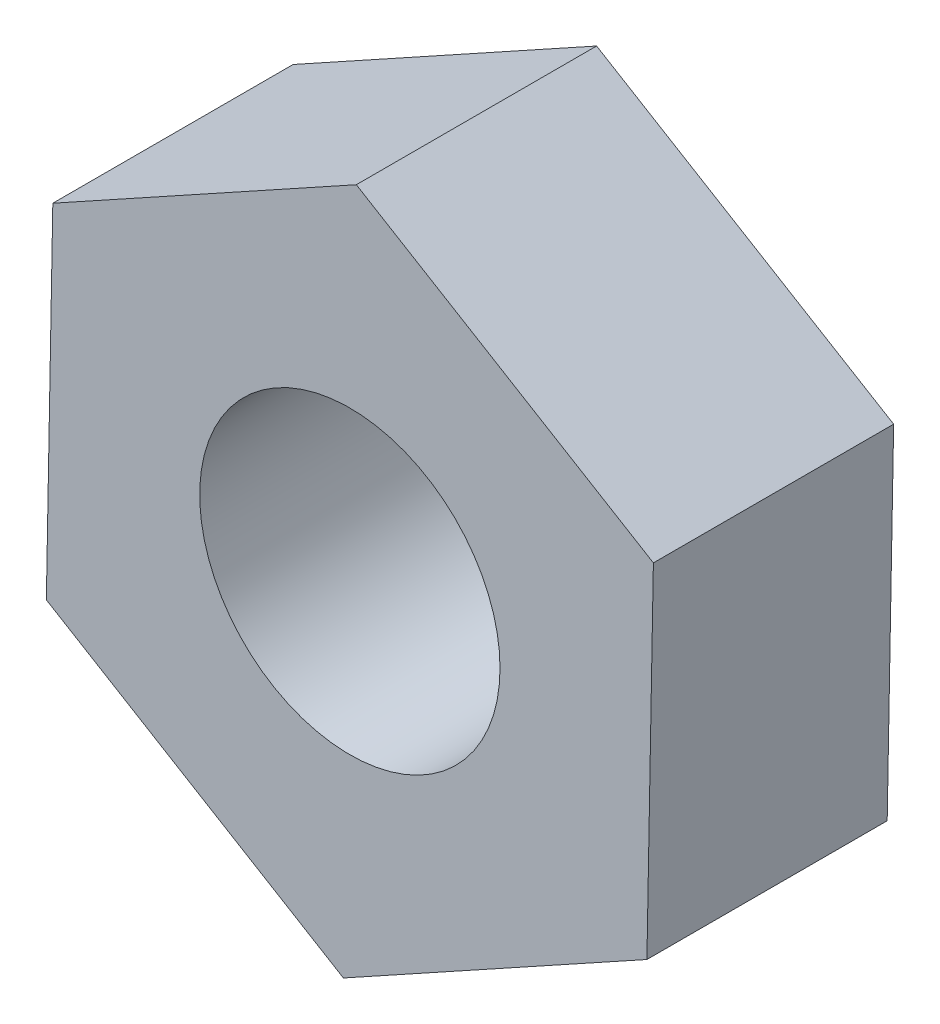
ISO-10303-21;
HEADER;
FILE_DESCRIPTION(('STEP AP214'),'2;1');
FILE_NAME('part.step','',(''),(''),'','','');
FILE_SCHEMA(('AUTOMOTIVE_DESIGN { 1 0 10303 214 1 1 1 1 }'));
ENDSEC;
DATA;
#1=APPLICATION_CONTEXT('core data for automotive mechanical design processes');
#2=APPLICATION_PROTOCOL_DEFINITION('international standard','automotive_design',2000,#1);
#3=PRODUCT_CONTEXT('',#1,'mechanical');
#4=PRODUCT('Part','Part','',(#3));
#5=PRODUCT_RELATED_PRODUCT_CATEGORY('part','',(#4));
#6=PRODUCT_DEFINITION_FORMATION('','',#4);
#7=PRODUCT_DEFINITION_CONTEXT('part definition',#1,'design');
#8=PRODUCT_DEFINITION('design','',#6,#7);
#9=PRODUCT_DEFINITION_SHAPE('','',#8);
#10=(LENGTH_UNIT() NAMED_UNIT(*) SI_UNIT(.MILLI.,.METRE.));
#11=(NAMED_UNIT(*) PLANE_ANGLE_UNIT() SI_UNIT($,.RADIAN.));
#12=(NAMED_UNIT(*) SI_UNIT($,.STERADIAN.) SOLID_ANGLE_UNIT());
#13=UNCERTAINTY_MEASURE_WITH_UNIT(LENGTH_MEASURE(1.E-05),#10,'distance_accuracy_value','');
#14=(GEOMETRIC_REPRESENTATION_CONTEXT(3) GLOBAL_UNCERTAINTY_ASSIGNED_CONTEXT((#13)) GLOBAL_UNIT_ASSIGNED_CONTEXT((#10,
#11,#12)) REPRESENTATION_CONTEXT('',''));
#15=CARTESIAN_POINT('',(0.,0.,0.));
#16=DIRECTION('',(0.,0.,1.));
#17=DIRECTION('',(1.,0.,0.));
#18=AXIS2_PLACEMENT_3D('',#15,#16,#17);
#19=CARTESIAN_POINT('',(0.,0.,1.6));
#20=DIRECTION('',(0.,0.,1.));
#21=DIRECTION('',(1.,0.,0.));
#22=AXIS2_PLACEMENT_3D('',#19,#20,#21);
#23=PLANE('',#22);
#24=DIRECTION('',(-0.875198972907005,-0.483763121602425,0.));
#25=VECTOR('',#24,1.);
#26=CARTESIAN_POINT('',(0.0430664819998365,2.30899948277636,1.6));
#27=LINE('',#26,#25);
#28=CARTESIAN_POINT('',(0.0430664819998365,2.30899948277636,1.6));
#29=VERTEX_POINT('',#28);
#30=CARTESIAN_POINT('',(-1.97811896840954,1.19179640885166,1.6));
#31=VERTEX_POINT('',#30);
#32=EDGE_CURVE('E135',#29,#31,#27,.T.);
#33=ORIENTED_EDGE('',*,*,#32,.T.);
#34=DIRECTION('',(-0.0186483337317416,-0.999826104704728,0.));
#35=VECTOR('',#34,1.);
#36=CARTESIAN_POINT('',(-1.97811896840954,1.19179640885166,1.6));
#37=LINE('',#36,#35);
#38=CARTESIAN_POINT('',(-2.02118545040937,-1.1172030739247,1.6));
#39=VERTEX_POINT('',#38);
#40=EDGE_CURVE('E93',#31,#39,#37,.T.);
#41=ORIENTED_EDGE('',*,*,#40,.T.);
#42=DIRECTION('',(0.856550639175264,-0.516062983102302,0.));
#43=VECTOR('',#42,1.);
#44=CARTESIAN_POINT('',(-2.02118545040937,-1.1172030739247,1.6));
#45=LINE('',#44,#43);
#46=CARTESIAN_POINT('',(-0.0430664819998364,-2.30899948277636,1.6));
#47=VERTEX_POINT('',#46);
#48=EDGE_CURVE('E106',#39,#47,#45,.T.);
#49=ORIENTED_EDGE('',*,*,#48,.T.);
#50=DIRECTION('',(0.875198972907005,0.483763121602425,0.));
#51=VECTOR('',#50,1.);
#52=CARTESIAN_POINT('',(-0.0430664819998364,-2.30899948277636,1.6));
#53=LINE('',#52,#51);
#54=CARTESIAN_POINT('',(1.97811896840954,-1.19179640885166,1.6));
#55=VERTEX_POINT('',#54);
#56=EDGE_CURVE('E100',#47,#55,#53,.T.);
#57=ORIENTED_EDGE('',*,*,#56,.T.);
#58=DIRECTION('',(0.0186483337317418,0.999826104704728,0.));
#59=VECTOR('',#58,1.);
#60=CARTESIAN_POINT('',(1.97811896840954,-1.19179640885166,1.6));
#61=LINE('',#60,#59);
#62=CARTESIAN_POINT('',(2.02118545040937,1.1172030739247,1.6));
#63=VERTEX_POINT('',#62);
#64=EDGE_CURVE('E104',#55,#63,#61,.T.);
#65=ORIENTED_EDGE('',*,*,#64,.T.);
#66=DIRECTION('',(-0.856550639175264,0.516062983102303,0.));
#67=VECTOR('',#66,1.);
#68=CARTESIAN_POINT('',(2.02118545040937,1.1172030739247,1.6));
#69=LINE('',#68,#67);
#70=EDGE_CURVE('E56',#63,#29,#69,.T.);
#71=ORIENTED_EDGE('',*,*,#70,.T.);
#72=EDGE_LOOP('',(#33,#41,#49,#57,#65,#71));
#73=FACE_BOUND('',#72,.T.);
#74=CARTESIAN_POINT('',(0.,0.,1.6));
#75=DIRECTION('',(0.,0.,1.));
#76=DIRECTION('',(1.,0.,0.));
#77=AXIS2_PLACEMENT_3D('',#74,#75,#76);
#78=CIRCLE('',#77,1.);
#79=CARTESIAN_POINT('',(1.,0.,1.6));
#80=VERTEX_POINT('',#79);
#81=EDGE_CURVE('E128',#80,#80,#78,.T.);
#82=ORIENTED_EDGE('',*,*,#81,.F.);
#83=EDGE_LOOP('',(#82));
#84=FACE_BOUND('',#83,.T.);
#85=ADVANCED_FACE('F39',(#73,#84),#23,.T.);
#86=CARTESIAN_POINT('',(0.,0.,0.));
#87=DIRECTION('',(0.,0.,1.));
#88=DIRECTION('',(1.,0.,0.));
#89=AXIS2_PLACEMENT_3D('',#86,#87,#88);
#90=PLANE('',#89);
#91=DIRECTION('',(-0.875198972907005,-0.483763121602425,0.));
#92=VECTOR('',#91,1.);
#93=CARTESIAN_POINT('',(0.0430664819998365,2.30899948277636,0.));
#94=LINE('',#93,#92);
#95=CARTESIAN_POINT('',(0.0430664819998365,2.30899948277636,0.));
#96=VERTEX_POINT('',#95);
#97=CARTESIAN_POINT('',(-1.97811896840954,1.19179640885166,0.));
#98=VERTEX_POINT('',#97);
#99=EDGE_CURVE('E124',#96,#98,#94,.T.);
#100=ORIENTED_EDGE('',*,*,#99,.F.);
#101=DIRECTION('',(-0.856550639175264,0.516062983102303,0.));
#102=VECTOR('',#101,1.);
#103=CARTESIAN_POINT('',(2.02118545040937,1.1172030739247,0.));
#104=LINE('',#103,#102);
#105=CARTESIAN_POINT('',(2.02118545040937,1.1172030739247,0.));
#106=VERTEX_POINT('',#105);
#107=EDGE_CURVE('E85',#106,#96,#104,.T.);
#108=ORIENTED_EDGE('',*,*,#107,.F.);
#109=DIRECTION('',(0.0186483337317418,0.999826104704728,0.));
#110=VECTOR('',#109,1.);
#111=CARTESIAN_POINT('',(1.97811896840954,-1.19179640885166,0.));
#112=LINE('',#111,#110);
#113=CARTESIAN_POINT('',(1.97811896840954,-1.19179640885166,0.));
#114=VERTEX_POINT('',#113);
#115=EDGE_CURVE('E79',#114,#106,#112,.T.);
#116=ORIENTED_EDGE('',*,*,#115,.F.);
#117=DIRECTION('',(0.875198972907005,0.483763121602425,0.));
#118=VECTOR('',#117,1.);
#119=CARTESIAN_POINT('',(-0.0430664819998364,-2.30899948277636,0.));
#120=LINE('',#119,#118);
#121=CARTESIAN_POINT('',(-0.0430664819998364,-2.30899948277636,0.));
#122=VERTEX_POINT('',#121);
#123=EDGE_CURVE('E114',#122,#114,#120,.T.);
#124=ORIENTED_EDGE('',*,*,#123,.F.);
#125=DIRECTION('',(0.856550639175264,-0.516062983102302,0.));
#126=VECTOR('',#125,1.);
#127=CARTESIAN_POINT('',(-2.02118545040937,-1.1172030739247,0.));
#128=LINE('',#127,#126);
#129=CARTESIAN_POINT('',(-2.02118545040937,-1.1172030739247,0.));
#130=VERTEX_POINT('',#129);
#131=EDGE_CURVE('E130',#130,#122,#128,.T.);
#132=ORIENTED_EDGE('',*,*,#131,.F.);
#133=DIRECTION('',(-0.0186483337317416,-0.999826104704728,0.));
#134=VECTOR('',#133,1.);
#135=CARTESIAN_POINT('',(-1.97811896840954,1.19179640885166,0.));
#136=LINE('',#135,#134);
#137=EDGE_CURVE('E127',#98,#130,#136,.T.);
#138=ORIENTED_EDGE('',*,*,#137,.F.);
#139=EDGE_LOOP('',(#100,#108,#116,#124,#132,#138));
#140=FACE_BOUND('',#139,.T.);
#141=CARTESIAN_POINT('',(0.,0.,0.));
#142=DIRECTION('',(0.,0.,1.));
#143=DIRECTION('',(1.,0.,0.));
#144=AXIS2_PLACEMENT_3D('',#141,#142,#143);
#145=CIRCLE('',#144,1.);
#146=CARTESIAN_POINT('',(1.,0.,0.));
#147=VERTEX_POINT('',#146);
#148=EDGE_CURVE('E230',#147,#147,#145,.T.);
#149=ORIENTED_EDGE('',*,*,#148,.T.);
#150=EDGE_LOOP('',(#149));
#151=FACE_BOUND('',#150,.T.);
#152=ADVANCED_FACE('F144',(#140,#151),#90,.F.);
#153=CARTESIAN_POINT('',(0.0430664819998365,2.30899948277636,1.6));
#154=DIRECTION('',(0.483763121602425,-0.875198972907005,0.));
#155=DIRECTION('',(0.875198972907005,0.483763121602425,0.));
#156=AXIS2_PLACEMENT_3D('',#153,#154,#155);
#157=PLANE('',#156);
#158=ORIENTED_EDGE('',*,*,#99,.T.);
#159=DIRECTION('',(0.,0.,-1.));
#160=VECTOR('',#159,1.);
#161=CARTESIAN_POINT('',(-1.97811896840954,1.19179640885166,1.6));
#162=LINE('',#161,#160);
#163=EDGE_CURVE('E11',#31,#98,#162,.T.);
#164=ORIENTED_EDGE('',*,*,#163,.F.);
#165=ORIENTED_EDGE('',*,*,#32,.F.);
#166=DIRECTION('',(0.,0.,-1.));
#167=VECTOR('',#166,1.);
#168=CARTESIAN_POINT('',(0.0430664819998365,2.30899948277636,1.6));
#169=LINE('',#168,#167);
#170=EDGE_CURVE('E120',#29,#96,#169,.T.);
#171=ORIENTED_EDGE('',*,*,#170,.T.);
#172=EDGE_LOOP('',(#158,#164,#165,#171));
#173=FACE_BOUND('',#172,.T.);
#174=ADVANCED_FACE('F41',(#173),#157,.F.);
#175=CARTESIAN_POINT('',(-1.97811896840954,1.19179640885166,1.6));
#176=DIRECTION('',(0.999826104704728,-0.0186483337317416,0.));
#177=DIRECTION('',(0.0186483337317416,0.999826104704728,0.));
#178=AXIS2_PLACEMENT_3D('',#175,#176,#177);
#179=PLANE('',#178);
#180=ORIENTED_EDGE('',*,*,#137,.T.);
#181=DIRECTION('',(0.,0.,-1.));
#182=VECTOR('',#181,1.);
#183=CARTESIAN_POINT('',(-2.02118545040937,-1.1172030739247,1.6));
#184=LINE('',#183,#182);
#185=EDGE_CURVE('E48',#39,#130,#184,.T.);
#186=ORIENTED_EDGE('',*,*,#185,.F.);
#187=ORIENTED_EDGE('',*,*,#40,.F.);
#188=ORIENTED_EDGE('',*,*,#163,.T.);
#189=EDGE_LOOP('',(#180,#186,#187,#188));
#190=FACE_BOUND('',#189,.T.);
#191=ADVANCED_FACE('F169',(#190),#179,.F.);
#192=CARTESIAN_POINT('',(-2.02118545040937,-1.1172030739247,1.6));
#193=DIRECTION('',(0.516062983102302,0.856550639175264,0.));
#194=DIRECTION('',(-0.856550639175264,0.516062983102302,0.));
#195=AXIS2_PLACEMENT_3D('',#192,#193,#194);
#196=PLANE('',#195);
#197=ORIENTED_EDGE('',*,*,#131,.T.);
#198=DIRECTION('',(0.,0.,-1.));
#199=VECTOR('',#198,1.);
#200=CARTESIAN_POINT('',(-0.0430664819998364,-2.30899948277636,1.6));
#201=LINE('',#200,#199);
#202=EDGE_CURVE('E115',#47,#122,#201,.T.);
#203=ORIENTED_EDGE('',*,*,#202,.F.);
#204=ORIENTED_EDGE('',*,*,#48,.F.);
#205=ORIENTED_EDGE('',*,*,#185,.T.);
#206=EDGE_LOOP('',(#197,#203,#204,#205));
#207=FACE_BOUND('',#206,.T.);
#208=ADVANCED_FACE('F141',(#207),#196,.F.);
#209=CARTESIAN_POINT('',(-0.0430664819998364,-2.30899948277636,1.6));
#210=DIRECTION('',(-0.483763121602425,0.875198972907005,0.));
#211=DIRECTION('',(-0.875198972907005,-0.483763121602425,0.));
#212=AXIS2_PLACEMENT_3D('',#209,#210,#211);
#213=PLANE('',#212);
#214=ORIENTED_EDGE('',*,*,#123,.T.);
#215=DIRECTION('',(0.,0.,-1.));
#216=VECTOR('',#215,1.);
#217=CARTESIAN_POINT('',(1.97811896840954,-1.19179640885166,1.6));
#218=LINE('',#217,#216);
#219=EDGE_CURVE('E111',#55,#114,#218,.T.);
#220=ORIENTED_EDGE('',*,*,#219,.F.);
#221=ORIENTED_EDGE('',*,*,#56,.F.);
#222=ORIENTED_EDGE('',*,*,#202,.T.);
#223=EDGE_LOOP('',(#214,#220,#221,#222));
#224=FACE_BOUND('',#223,.T.);
#225=ADVANCED_FACE('F112',(#224),#213,.F.);
#226=CARTESIAN_POINT('',(1.97811896840954,-1.19179640885166,1.6));
#227=DIRECTION('',(-0.999826104704728,0.0186483337317418,0.));
#228=DIRECTION('',(-0.0186483337317418,-0.999826104704728,0.));
#229=AXIS2_PLACEMENT_3D('',#226,#227,#228);
#230=PLANE('',#229);
#231=ORIENTED_EDGE('',*,*,#115,.T.);
#232=DIRECTION('',(0.,0.,-1.));
#233=VECTOR('',#232,1.);
#234=CARTESIAN_POINT('',(2.02118545040937,1.1172030739247,1.6));
#235=LINE('',#234,#233);
#236=EDGE_CURVE('E116',#63,#106,#235,.T.);
#237=ORIENTED_EDGE('',*,*,#236,.F.);
#238=ORIENTED_EDGE('',*,*,#64,.F.);
#239=ORIENTED_EDGE('',*,*,#219,.T.);
#240=EDGE_LOOP('',(#231,#237,#238,#239));
#241=FACE_BOUND('',#240,.T.);
#242=ADVANCED_FACE('F118',(#241),#230,.F.);
#243=CARTESIAN_POINT('',(2.02118545040937,1.1172030739247,1.6));
#244=DIRECTION('',(-0.516062983102303,-0.856550639175264,0.));
#245=DIRECTION('',(0.856550639175264,-0.516062983102303,0.));
#246=AXIS2_PLACEMENT_3D('',#243,#244,#245);
#247=PLANE('',#246);
#248=ORIENTED_EDGE('',*,*,#107,.T.);
#249=ORIENTED_EDGE('',*,*,#170,.F.);
#250=ORIENTED_EDGE('',*,*,#70,.F.);
#251=ORIENTED_EDGE('',*,*,#236,.T.);
#252=EDGE_LOOP('',(#248,#249,#250,#251));
#253=FACE_BOUND('',#252,.T.);
#254=ADVANCED_FACE('F149',(#253),#247,.F.);
#255=CARTESIAN_POINT('',(0.,0.,1.6));
#256=DIRECTION('',(0.,0.,-1.));
#257=DIRECTION('',(-1.,0.,0.));
#258=AXIS2_PLACEMENT_3D('',#255,#256,#257);
#259=CYLINDRICAL_SURFACE('',#258,1.);
#260=ORIENTED_EDGE('',*,*,#81,.T.);
#261=EDGE_LOOP('',(#260));
#262=FACE_BOUND('',#261,.T.);
#263=ORIENTED_EDGE('',*,*,#148,.F.);
#264=EDGE_LOOP('',(#263));
#265=FACE_BOUND('',#264,.T.);
#266=ADVANCED_FACE('F151',(#262,#265),#259,.F.);
#267=CLOSED_SHELL('',(#85,#152,#174,#191,#208,#225,#242,#254,#266));
#268=MANIFOLD_SOLID_BREP('B2',#267);
#269=ADVANCED_BREP_SHAPE_REPRESENTATION('',(#18,#268),#14);
#270=SHAPE_DEFINITION_REPRESENTATION(#9,#269);
ENDSEC;
END-ISO-10303-21;
